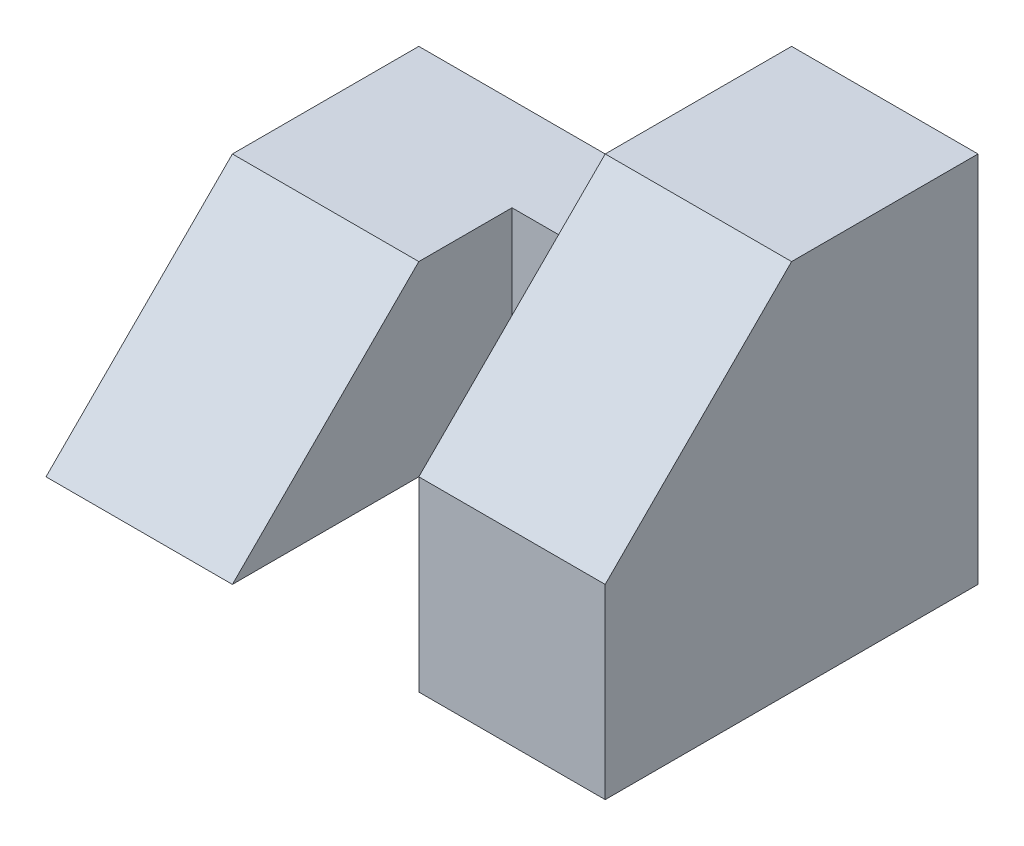
ISO-10303-21;
HEADER;
FILE_DESCRIPTION(('STEP AP214'),'2;1');
FILE_NAME('part.step','',(''),(''),'','','');
FILE_SCHEMA(('AUTOMOTIVE_DESIGN { 1 0 10303 214 1 1 1 1 }'));
ENDSEC;
DATA;
#1=APPLICATION_CONTEXT('core data for automotive mechanical design processes');
#2=APPLICATION_PROTOCOL_DEFINITION('international standard','automotive_design',2000,#1);
#3=PRODUCT_CONTEXT('',#1,'mechanical');
#4=PRODUCT('Part','Part','',(#3));
#5=PRODUCT_RELATED_PRODUCT_CATEGORY('part','',(#4));
#6=PRODUCT_DEFINITION_FORMATION('','',#4);
#7=PRODUCT_DEFINITION_CONTEXT('part definition',#1,'design');
#8=PRODUCT_DEFINITION('design','',#6,#7);
#9=PRODUCT_DEFINITION_SHAPE('','',#8);
#10=(LENGTH_UNIT() NAMED_UNIT(*) SI_UNIT(.MILLI.,.METRE.));
#11=(NAMED_UNIT(*) PLANE_ANGLE_UNIT() SI_UNIT($,.RADIAN.));
#12=(NAMED_UNIT(*) SI_UNIT($,.STERADIAN.) SOLID_ANGLE_UNIT());
#13=UNCERTAINTY_MEASURE_WITH_UNIT(LENGTH_MEASURE(1.E-05),#10,'distance_accuracy_value','');
#14=(GEOMETRIC_REPRESENTATION_CONTEXT(3) GLOBAL_UNCERTAINTY_ASSIGNED_CONTEXT((#13)) GLOBAL_UNIT_ASSIGNED_CONTEXT((#10,
#11,#12)) REPRESENTATION_CONTEXT('',''));
#15=CARTESIAN_POINT('',(0.,0.,0.));
#16=DIRECTION('',(0.,0.,1.));
#17=DIRECTION('',(1.,0.,0.));
#18=AXIS2_PLACEMENT_3D('',#15,#16,#17);
#19=CARTESIAN_POINT('',(0.,0.,50.8));
#20=DIRECTION('',(0.,0.,-1.));
#21=DIRECTION('',(-1.,0.,0.));
#22=AXIS2_PLACEMENT_3D('',#19,#20,#21);
#23=PLANE('',#22);
#24=DIRECTION('',(0.,1.,0.));
#25=VECTOR('',#24,1.);
#26=CARTESIAN_POINT('',(76.2,-50.8,50.8));
#27=LINE('',#26,#25);
#28=CARTESIAN_POINT('',(76.2,-50.8,50.8));
#29=VERTEX_POINT('',#28);
#30=CARTESIAN_POINT('',(76.2,-1.66533453693773E-13,50.8));
#31=VERTEX_POINT('',#30);
#32=EDGE_CURVE('E183',#29,#31,#27,.T.);
#33=ORIENTED_EDGE('',*,*,#32,.T.);
#34=DIRECTION('',(-1.,0.,0.));
#35=VECTOR('',#34,1.);
#36=CARTESIAN_POINT('',(0.,-1.66533453693773E-13,50.8));
#37=LINE('',#36,#35);
#38=CARTESIAN_POINT('',(25.4,-1.66533453693773E-13,50.8));
#39=VERTEX_POINT('',#38);
#40=EDGE_CURVE('E225',#31,#39,#37,.T.);
#41=ORIENTED_EDGE('',*,*,#40,.T.);
#42=DIRECTION('',(0.,1.,0.));
#43=VECTOR('',#42,1.);
#44=CARTESIAN_POINT('',(25.4,50.8,50.8));
#45=LINE('',#44,#43);
#46=CARTESIAN_POINT('',(25.4,-50.8,50.8));
#47=VERTEX_POINT('',#46);
#48=EDGE_CURVE('E161',#47,#39,#45,.T.);
#49=ORIENTED_EDGE('',*,*,#48,.F.);
#50=DIRECTION('',(1.,0.,0.));
#51=VECTOR('',#50,1.);
#52=CARTESIAN_POINT('',(-76.2,-50.8,50.8));
#53=LINE('',#52,#51);
#54=EDGE_CURVE('E147',#47,#29,#53,.T.);
#55=ORIENTED_EDGE('',*,*,#54,.T.);
#56=EDGE_LOOP('',(#33,#41,#49,#55));
#57=FACE_BOUND('',#56,.T.);
#58=ADVANCED_FACE('F46',(#57),#23,.F.);
#59=CARTESIAN_POINT('',(76.2,-50.8,50.8));
#60=DIRECTION('',(-1.,0.,0.));
#61=DIRECTION('',(0.,0.,1.));
#62=AXIS2_PLACEMENT_3D('',#59,#60,#61);
#63=PLANE('',#62);
#64=DIRECTION('',(0.,0.,-1.));
#65=VECTOR('',#64,1.);
#66=CARTESIAN_POINT('',(76.2,50.8,50.8));
#67=LINE('',#66,#65);
#68=CARTESIAN_POINT('',(76.2,50.8,-1.52655665885959E-13));
#69=VERTEX_POINT('',#68);
#70=CARTESIAN_POINT('',(76.2,50.8,-50.8));
#71=VERTEX_POINT('',#70);
#72=EDGE_CURVE('E212',#69,#71,#67,.T.);
#73=ORIENTED_EDGE('',*,*,#72,.F.);
#74=DIRECTION('',(0.,0.707106781186548,-0.707106781186548));
#75=VECTOR('',#74,1.);
#76=CARTESIAN_POINT('',(76.2,-1.66533453693773E-13,50.8));
#77=LINE('',#76,#75);
#78=EDGE_CURVE('E11',#69,#31,#77,.F.);
#79=ORIENTED_EDGE('',*,*,#78,.T.);
#80=ORIENTED_EDGE('',*,*,#32,.F.);
#81=DIRECTION('',(0.,0.,-1.));
#82=VECTOR('',#81,1.);
#83=CARTESIAN_POINT('',(76.2,-50.8,50.8));
#84=LINE('',#83,#82);
#85=CARTESIAN_POINT('',(76.2,-50.8,-50.8));
#86=VERTEX_POINT('',#85);
#87=EDGE_CURVE('E192',#29,#86,#84,.T.);
#88=ORIENTED_EDGE('',*,*,#87,.T.);
#89=DIRECTION('',(0.,1.,0.));
#90=VECTOR('',#89,1.);
#91=CARTESIAN_POINT('',(76.2,-50.8,-50.8));
#92=LINE('',#91,#90);
#93=EDGE_CURVE('E177',#86,#71,#92,.T.);
#94=ORIENTED_EDGE('',*,*,#93,.T.);
#95=EDGE_LOOP('',(#73,#79,#80,#88,#94));
#96=FACE_BOUND('',#95,.T.);
#97=ADVANCED_FACE('F238',(#96),#63,.F.);
#98=CARTESIAN_POINT('',(-76.2,50.8,50.8));
#99=DIRECTION('',(0.,-1.,0.));
#100=DIRECTION('',(0.,0.,-1.));
#101=AXIS2_PLACEMENT_3D('',#98,#99,#100);
#102=PLANE('',#101);
#103=DIRECTION('',(0.,0.,1.));
#104=VECTOR('',#103,1.);
#105=CARTESIAN_POINT('',(25.4,50.8,-50.8));
#106=LINE('',#105,#104);
#107=CARTESIAN_POINT('',(25.4,50.8,-50.8));
#108=VERTEX_POINT('',#107);
#109=CARTESIAN_POINT('',(25.4,50.8,-1.52655665885959E-13));
#110=VERTEX_POINT('',#109);
#111=EDGE_CURVE('E174',#108,#110,#106,.T.);
#112=ORIENTED_EDGE('',*,*,#111,.T.);
#113=DIRECTION('',(1.,0.,0.));
#114=VECTOR('',#113,1.);
#115=CARTESIAN_POINT('',(-76.2,50.8,-1.52655665885959E-13));
#116=LINE('',#115,#114);
#117=EDGE_CURVE('E56',#110,#69,#116,.T.);
#118=ORIENTED_EDGE('',*,*,#117,.T.);
#119=ORIENTED_EDGE('',*,*,#72,.T.);
#120=DIRECTION('',(-1.,0.,0.));
#121=VECTOR('',#120,1.);
#122=CARTESIAN_POINT('',(-76.2,50.8,-50.8));
#123=LINE('',#122,#121);
#124=EDGE_CURVE('E196',#71,#108,#123,.T.);
#125=ORIENTED_EDGE('',*,*,#124,.T.);
#126=EDGE_LOOP('',(#112,#118,#119,#125));
#127=FACE_BOUND('',#126,.T.);
#128=ADVANCED_FACE('F253',(#127),#102,.F.);
#129=CARTESIAN_POINT('',(-76.2,-50.8,50.8));
#130=DIRECTION('',(1.,0.,0.));
#131=DIRECTION('',(0.,0.,-1.));
#132=AXIS2_PLACEMENT_3D('',#129,#130,#131);
#133=PLANE('',#132);
#134=DIRECTION('',(0.,0.,-1.));
#135=VECTOR('',#134,1.);
#136=CARTESIAN_POINT('',(-76.2,-50.8,50.8));
#137=LINE('',#136,#135);
#138=CARTESIAN_POINT('',(-76.2,-50.8,50.8));
#139=VERTEX_POINT('',#138);
#140=CARTESIAN_POINT('',(-76.2,-50.8,-50.8));
#141=VERTEX_POINT('',#140);
#142=EDGE_CURVE('E208',#139,#141,#137,.T.);
#143=ORIENTED_EDGE('',*,*,#142,.F.);
#144=DIRECTION('',(0.,-0.707106781186548,0.707106781186548));
#145=VECTOR('',#144,1.);
#146=CARTESIAN_POINT('',(-76.2,0.,-1.80411241501588E-13));
#147=LINE('',#146,#145);
#148=CARTESIAN_POINT('',(-76.2,0.,-1.80411241501588E-13));
#149=VERTEX_POINT('',#148);
#150=EDGE_CURVE('E222',#139,#149,#147,.F.);
#151=ORIENTED_EDGE('',*,*,#150,.T.);
#152=DIRECTION('',(0.,0.,1.));
#153=VECTOR('',#152,1.);
#154=CARTESIAN_POINT('',(-76.2,0.,-50.8));
#155=LINE('',#154,#153);
#156=CARTESIAN_POINT('',(-76.2,0.,-50.8));
#157=VERTEX_POINT('',#156);
#158=EDGE_CURVE('E171',#157,#149,#155,.T.);
#159=ORIENTED_EDGE('',*,*,#158,.F.);
#160=DIRECTION('',(0.,-1.,0.));
#161=VECTOR('',#160,1.);
#162=CARTESIAN_POINT('',(-76.2,-50.8,-50.8));
#163=LINE('',#162,#161);
#164=EDGE_CURVE('E200',#157,#141,#163,.T.);
#165=ORIENTED_EDGE('',*,*,#164,.T.);
#166=EDGE_LOOP('',(#143,#151,#159,#165));
#167=FACE_BOUND('',#166,.T.);
#168=ADVANCED_FACE('F265',(#167),#133,.F.);
#169=CARTESIAN_POINT('',(-76.2,-50.8,50.8));
#170=DIRECTION('',(0.,1.,0.));
#171=DIRECTION('',(0.,0.,1.));
#172=AXIS2_PLACEMENT_3D('',#169,#170,#171);
#173=PLANE('',#172);
#174=ORIENTED_EDGE('',*,*,#54,.F.);
#175=DIRECTION('',(0.,0.,-1.));
#176=VECTOR('',#175,1.);
#177=CARTESIAN_POINT('',(25.4,-50.8,50.8));
#178=LINE('',#177,#176);
#179=CARTESIAN_POINT('',(25.4,-50.8,-25.4));
#180=VERTEX_POINT('',#179);
#181=EDGE_CURVE('E126',#47,#180,#178,.T.);
#182=ORIENTED_EDGE('',*,*,#181,.T.);
#183=DIRECTION('',(-1.,0.,0.));
#184=VECTOR('',#183,1.);
#185=CARTESIAN_POINT('',(25.4,-50.8,-25.4));
#186=LINE('',#185,#184);
#187=CARTESIAN_POINT('',(-25.4,-50.8,-25.4));
#188=VERTEX_POINT('',#187);
#189=EDGE_CURVE('E138',#180,#188,#186,.T.);
#190=ORIENTED_EDGE('',*,*,#189,.T.);
#191=DIRECTION('',(0.,0.,1.));
#192=VECTOR('',#191,1.);
#193=CARTESIAN_POINT('',(-25.4,-50.8,50.8));
#194=LINE('',#193,#192);
#195=CARTESIAN_POINT('',(-25.4,-50.8,50.8));
#196=VERTEX_POINT('',#195);
#197=EDGE_CURVE('E135',#188,#196,#194,.T.);
#198=ORIENTED_EDGE('',*,*,#197,.T.);
#199=EDGE_CURVE('E188',#139,#196,#53,.T.);
#200=ORIENTED_EDGE('',*,*,#199,.F.);
#201=ORIENTED_EDGE('',*,*,#142,.T.);
#202=DIRECTION('',(1.,0.,0.));
#203=VECTOR('',#202,1.);
#204=CARTESIAN_POINT('',(-76.2,-50.8,-50.8));
#205=LINE('',#204,#203);
#206=EDGE_CURVE('E187',#141,#86,#205,.T.);
#207=ORIENTED_EDGE('',*,*,#206,.T.);
#208=ORIENTED_EDGE('',*,*,#87,.F.);
#209=EDGE_LOOP('',(#174,#182,#190,#198,#200,#201,#207,#208));
#210=FACE_BOUND('',#209,.T.);
#211=ADVANCED_FACE('F145',(#210),#173,.F.);
#212=CARTESIAN_POINT('',(0.,0.,-50.8));
#213=DIRECTION('',(0.,0.,-1.));
#214=DIRECTION('',(-1.,0.,0.));
#215=AXIS2_PLACEMENT_3D('',#212,#213,#214);
#216=PLANE('',#215);
#217=DIRECTION('',(0.,1.,0.));
#218=VECTOR('',#217,1.);
#219=CARTESIAN_POINT('',(25.4,50.8,-50.8));
#220=LINE('',#219,#218);
#221=CARTESIAN_POINT('',(25.4,0.,-50.8));
#222=VERTEX_POINT('',#221);
#223=EDGE_CURVE('E167',#222,#108,#220,.T.);
#224=ORIENTED_EDGE('',*,*,#223,.T.);
#225=ORIENTED_EDGE('',*,*,#124,.F.);
#226=ORIENTED_EDGE('',*,*,#93,.F.);
#227=ORIENTED_EDGE('',*,*,#206,.F.);
#228=ORIENTED_EDGE('',*,*,#164,.F.);
#229=DIRECTION('',(1.,0.,0.));
#230=VECTOR('',#229,1.);
#231=CARTESIAN_POINT('',(-76.2,0.,-50.8));
#232=LINE('',#231,#230);
#233=EDGE_CURVE('E163',#157,#222,#232,.T.);
#234=ORIENTED_EDGE('',*,*,#233,.T.);
#235=EDGE_LOOP('',(#224,#225,#226,#227,#228,#234));
#236=FACE_BOUND('',#235,.T.);
#237=ADVANCED_FACE('F259',(#236),#216,.T.);
#238=CARTESIAN_POINT('',(25.4,50.8,-50.8));
#239=DIRECTION('',(1.,0.,0.));
#240=DIRECTION('',(0.,0.,-1.));
#241=AXIS2_PLACEMENT_3D('',#238,#239,#240);
#242=PLANE('',#241);
#243=ORIENTED_EDGE('',*,*,#48,.T.);
#244=DIRECTION('',(0.,-0.707106781186548,0.707106781186548));
#245=VECTOR('',#244,1.);
#246=CARTESIAN_POINT('',(25.4,-1.66533453693773E-13,50.8));
#247=LINE('',#246,#245);
#248=EDGE_CURVE('E70',#39,#110,#247,.F.);
#249=ORIENTED_EDGE('',*,*,#248,.T.);
#250=ORIENTED_EDGE('',*,*,#111,.F.);
#251=ORIENTED_EDGE('',*,*,#223,.F.);
#252=DIRECTION('',(0.,0.,1.));
#253=VECTOR('',#252,1.);
#254=CARTESIAN_POINT('',(25.4,0.,-50.8));
#255=LINE('',#254,#253);
#256=CARTESIAN_POINT('',(25.4,0.,-25.4));
#257=VERTEX_POINT('',#256);
#258=EDGE_CURVE('E129',#222,#257,#255,.T.);
#259=ORIENTED_EDGE('',*,*,#258,.T.);
#260=DIRECTION('',(0.,1.,0.));
#261=VECTOR('',#260,1.);
#262=CARTESIAN_POINT('',(25.4,-50.8,-25.4));
#263=LINE('',#262,#261);
#264=EDGE_CURVE('E122',#180,#257,#263,.T.);
#265=ORIENTED_EDGE('',*,*,#264,.F.);
#266=ORIENTED_EDGE('',*,*,#181,.F.);
#267=EDGE_LOOP('',(#243,#249,#250,#251,#259,#265,#266));
#268=FACE_BOUND('',#267,.T.);
#269=ADVANCED_FACE('F124',(#268),#242,.F.);
#270=CARTESIAN_POINT('',(-76.2,0.,-50.8));
#271=DIRECTION('',(0.,-1.,0.));
#272=DIRECTION('',(0.,0.,-1.));
#273=AXIS2_PLACEMENT_3D('',#270,#271,#272);
#274=PLANE('',#273);
#275=ORIENTED_EDGE('',*,*,#158,.T.);
#276=DIRECTION('',(1.,0.,0.));
#277=VECTOR('',#276,1.);
#278=CARTESIAN_POINT('',(-76.2,0.,-1.80411241501588E-13));
#279=LINE('',#278,#277);
#280=CARTESIAN_POINT('',(-25.4,0.,-1.80411241501588E-13));
#281=VERTEX_POINT('',#280);
#282=EDGE_CURVE('E215',#149,#281,#279,.T.);
#283=ORIENTED_EDGE('',*,*,#282,.T.);
#284=DIRECTION('',(0.,0.,1.));
#285=VECTOR('',#284,1.);
#286=CARTESIAN_POINT('',(-25.4,0.,50.8));
#287=LINE('',#286,#285);
#288=CARTESIAN_POINT('',(-25.4,0.,-25.4));
#289=VERTEX_POINT('',#288);
#290=EDGE_CURVE('E149',#289,#281,#287,.T.);
#291=ORIENTED_EDGE('',*,*,#290,.F.);
#292=DIRECTION('',(-1.,0.,0.));
#293=VECTOR('',#292,1.);
#294=CARTESIAN_POINT('',(25.4,0.,-25.4));
#295=LINE('',#294,#293);
#296=EDGE_CURVE('E153',#257,#289,#295,.T.);
#297=ORIENTED_EDGE('',*,*,#296,.F.);
#298=ORIENTED_EDGE('',*,*,#258,.F.);
#299=ORIENTED_EDGE('',*,*,#233,.F.);
#300=EDGE_LOOP('',(#275,#283,#291,#297,#298,#299));
#301=FACE_BOUND('',#300,.T.);
#302=ADVANCED_FACE('F257',(#301),#274,.F.);
#303=CARTESIAN_POINT('',(-25.4,-50.8,50.8));
#304=DIRECTION('',(-1.,0.,0.));
#305=DIRECTION('',(0.,0.,1.));
#306=AXIS2_PLACEMENT_3D('',#303,#304,#305);
#307=PLANE('',#306);
#308=ORIENTED_EDGE('',*,*,#290,.T.);
#309=DIRECTION('',(0.,0.707106781186548,-0.707106781186548));
#310=VECTOR('',#309,1.);
#311=CARTESIAN_POINT('',(-25.4,0.,-1.80411241501588E-13));
#312=LINE('',#311,#310);
#313=EDGE_CURVE('E219',#281,#196,#312,.F.);
#314=ORIENTED_EDGE('',*,*,#313,.T.);
#315=ORIENTED_EDGE('',*,*,#197,.F.);
#316=DIRECTION('',(0.,1.,0.));
#317=VECTOR('',#316,1.);
#318=CARTESIAN_POINT('',(-25.4,-50.8,-25.4));
#319=LINE('',#318,#317);
#320=EDGE_CURVE('E134',#188,#289,#319,.T.);
#321=ORIENTED_EDGE('',*,*,#320,.T.);
#322=EDGE_LOOP('',(#308,#314,#315,#321));
#323=FACE_BOUND('',#322,.T.);
#324=ADVANCED_FACE('F286',(#323),#307,.F.);
#325=CARTESIAN_POINT('',(25.4,-50.8,-25.4));
#326=DIRECTION('',(0.,0.,-1.));
#327=DIRECTION('',(-1.,0.,0.));
#328=AXIS2_PLACEMENT_3D('',#325,#326,#327);
#329=PLANE('',#328);
#330=ORIENTED_EDGE('',*,*,#296,.T.);
#331=ORIENTED_EDGE('',*,*,#320,.F.);
#332=ORIENTED_EDGE('',*,*,#189,.F.);
#333=ORIENTED_EDGE('',*,*,#264,.T.);
#334=EDGE_LOOP('',(#330,#331,#332,#333));
#335=FACE_BOUND('',#334,.T.);
#336=ADVANCED_FACE('F139',(#335),#329,.F.);
#337=CARTESIAN_POINT('',(-76.2,0.,-1.80411241501588E-13));
#338=DIRECTION('',(0.,-0.707106781186548,-0.707106781186548));
#339=DIRECTION('',(1.,0.,0.));
#340=AXIS2_PLACEMENT_3D('',#337,#338,#339);
#341=PLANE('',#340);
#342=ORIENTED_EDGE('',*,*,#150,.F.);
#343=ORIENTED_EDGE('',*,*,#199,.T.);
#344=ORIENTED_EDGE('',*,*,#313,.F.);
#345=ORIENTED_EDGE('',*,*,#282,.F.);
#346=EDGE_LOOP('',(#342,#343,#344,#345));
#347=FACE_BOUND('',#346,.T.);
#348=ADVANCED_FACE('F242',(#347),#341,.F.);
#349=CARTESIAN_POINT('',(0.,-1.66533453693773E-13,50.8));
#350=DIRECTION('',(0.,-0.707106781186548,-0.707106781186548));
#351=DIRECTION('',(-1.,0.,0.));
#352=AXIS2_PLACEMENT_3D('',#349,#350,#351);
#353=PLANE('',#352);
#354=ORIENTED_EDGE('',*,*,#78,.F.);
#355=ORIENTED_EDGE('',*,*,#117,.F.);
#356=ORIENTED_EDGE('',*,*,#248,.F.);
#357=ORIENTED_EDGE('',*,*,#40,.F.);
#358=EDGE_LOOP('',(#354,#355,#356,#357));
#359=FACE_BOUND('',#358,.T.);
#360=ADVANCED_FACE('F49',(#359),#353,.F.);
#361=CLOSED_SHELL('',(#58,#97,#128,#168,#211,#237,#269,#302,#324,#336,#348,#360));
#362=MANIFOLD_SOLID_BREP('B2',#361);
#363=ADVANCED_BREP_SHAPE_REPRESENTATION('',(#18,#362),#14);
#364=SHAPE_DEFINITION_REPRESENTATION(#9,#363);
ENDSEC;
END-ISO-10303-21;
